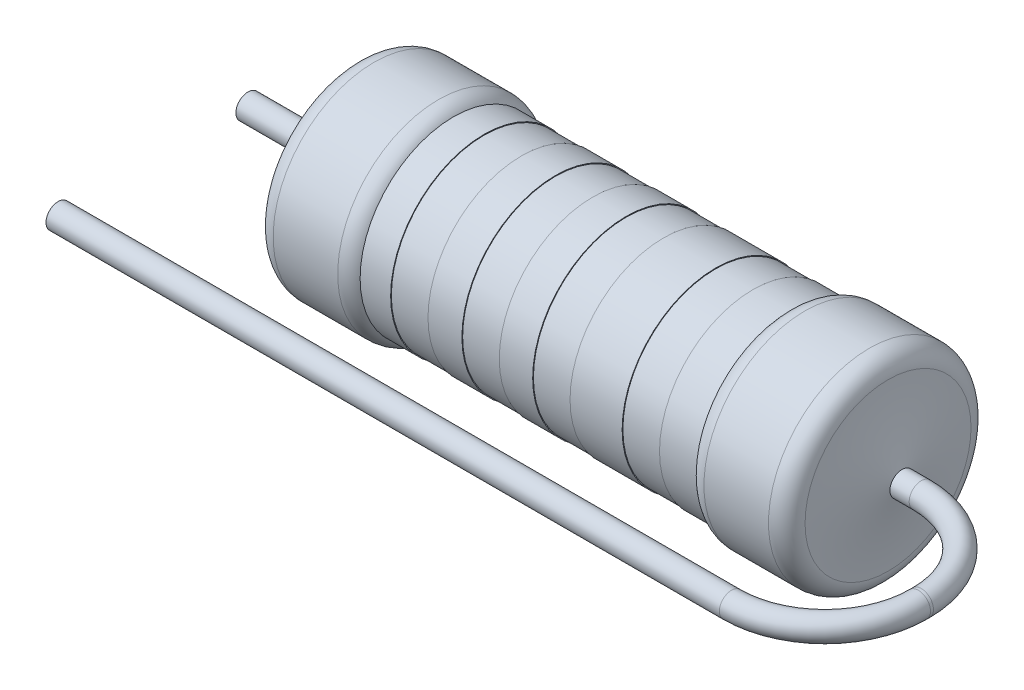
ISO-10303-21;
HEADER;
FILE_DESCRIPTION(('STEP AP214'),'2;1');
FILE_NAME('part.step','',(''),(''),'','','');
FILE_SCHEMA(('AUTOMOTIVE_DESIGN { 1 0 10303 214 1 1 1 1 }'));
ENDSEC;
DATA;
#1=APPLICATION_CONTEXT('core data for automotive mechanical design processes');
#2=APPLICATION_PROTOCOL_DEFINITION('international standard','automotive_design',2000,#1);
#3=PRODUCT_CONTEXT('',#1,'mechanical');
#4=PRODUCT('Part','Part','',(#3));
#5=PRODUCT_RELATED_PRODUCT_CATEGORY('part','',(#4));
#6=PRODUCT_DEFINITION_FORMATION('','',#4);
#7=PRODUCT_DEFINITION_CONTEXT('part definition',#1,'design');
#8=PRODUCT_DEFINITION('design','',#6,#7);
#9=PRODUCT_DEFINITION_SHAPE('','',#8);
#10=(LENGTH_UNIT() NAMED_UNIT(*) SI_UNIT(.MILLI.,.METRE.));
#11=(NAMED_UNIT(*) PLANE_ANGLE_UNIT() SI_UNIT($,.RADIAN.));
#12=(NAMED_UNIT(*) SI_UNIT($,.STERADIAN.) SOLID_ANGLE_UNIT());
#13=UNCERTAINTY_MEASURE_WITH_UNIT(LENGTH_MEASURE(1.E-05),#10,'distance_accuracy_value','');
#14=(GEOMETRIC_REPRESENTATION_CONTEXT(3) GLOBAL_UNCERTAINTY_ASSIGNED_CONTEXT((#13)) GLOBAL_UNIT_ASSIGNED_CONTEXT((#10,
#11,#12)) REPRESENTATION_CONTEXT('',''));
#15=CARTESIAN_POINT('',(0.,0.,0.));
#16=DIRECTION('',(0.,0.,1.));
#17=DIRECTION('',(1.,0.,0.));
#18=AXIS2_PLACEMENT_3D('',#15,#16,#17);
#19=CARTESIAN_POINT('',(7.5,0.,0.));
#20=DIRECTION('',(1.,0.,0.));
#21=DIRECTION('',(0.,0.,-1.));
#22=AXIS2_PLACEMENT_3D('',#19,#20,#21);
#23=PLANE('',#22);
#24=CARTESIAN_POINT('',(7.5,0.,0.));
#25=DIRECTION('',(1.,0.,0.));
#26=DIRECTION('',(0.,0.,-1.));
#27=AXIS2_PLACEMENT_3D('',#24,#25,#26);
#28=CIRCLE('',#27,0.325);
#29=CARTESIAN_POINT('',(7.5,0.,-0.325));
#30=VERTEX_POINT('',#29);
#31=EDGE_CURVE('E57',#30,#30,#28,.T.);
#32=ORIENTED_EDGE('',*,*,#31,.F.);
#33=EDGE_LOOP('',(#32));
#34=FACE_BOUND('',#33,.T.);
#35=ADVANCED_FACE('F45',(#34),#23,.F.);
#36=CARTESIAN_POINT('',(-10.,0.,5.08));
#37=DIRECTION('',(-1.,0.,0.));
#38=DIRECTION('',(0.,0.,1.));
#39=AXIS2_PLACEMENT_3D('',#36,#37,#38);
#40=PLANE('',#39);
#41=CARTESIAN_POINT('',(-10.,0.,5.08));
#42=DIRECTION('',(-1.,0.,0.));
#43=DIRECTION('',(0.,0.,1.));
#44=AXIS2_PLACEMENT_3D('',#41,#42,#43);
#45=CIRCLE('',#44,0.325);
#46=CARTESIAN_POINT('',(-10.,0.,5.405));
#47=VERTEX_POINT('',#46);
#48=EDGE_CURVE('E12',#47,#47,#45,.T.);
#49=ORIENTED_EDGE('',*,*,#48,.T.);
#50=EDGE_LOOP('',(#49));
#51=FACE_BOUND('',#50,.T.);
#52=ADVANCED_FACE('F60',(#51),#40,.T.);
#53=CARTESIAN_POINT('',(7.5,0.,0.));
#54=DIRECTION('',(1.,0.,0.));
#55=DIRECTION('',(0.,0.,-1.));
#56=AXIS2_PLACEMENT_3D('',#53,#54,#55);
#57=CYLINDRICAL_SURFACE('',#56,0.325);
#58=CARTESIAN_POINT('',(8.01672707535682,0.,0.));
#59=DIRECTION('',(1.,0.,0.));
#60=DIRECTION('',(0.,0.,-1.));
#61=AXIS2_PLACEMENT_3D('',#58,#59,#60);
#62=CIRCLE('',#61,0.325);
#63=CARTESIAN_POINT('',(8.01672707535682,0.,-0.324999999999948));
#64=VERTEX_POINT('',#63);
#65=EDGE_CURVE('E77',#64,#64,#62,.T.);
#66=ORIENTED_EDGE('',*,*,#65,.F.);
#67=EDGE_LOOP('',(#66));
#68=FACE_BOUND('',#67,.T.);
#69=ORIENTED_EDGE('',*,*,#31,.T.);
#70=EDGE_LOOP('',(#69));
#71=FACE_BOUND('',#70,.T.);
#72=ADVANCED_FACE('F81',(#68,#71),#57,.T.);
#73=CARTESIAN_POINT('',(8.01672707535683,0.,2.5));
#74=DIRECTION('',(0.,-1.,0.));
#75=DIRECTION('',(0.,0.,-1.));
#76=AXIS2_PLACEMENT_3D('',#73,#74,#75);
#77=TOROIDAL_SURFACE('',#76,2.49999999999995,0.325);
#78=CARTESIAN_POINT('',(10.5167270753568,0.,2.50000000000002));
#79=DIRECTION('',(0.,0.,1.));
#80=DIRECTION('',(1.,0.,0.));
#81=AXIS2_PLACEMENT_3D('',#78,#79,#80);
#82=CIRCLE('',#81,0.325);
#83=CARTESIAN_POINT('',(10.8417270753568,0.,2.50000000000002));
#84=VERTEX_POINT('',#83);
#85=EDGE_CURVE('E72',#84,#84,#82,.T.);
#86=CARTESIAN_POINT('',(8.01672707535683,0.,2.5));
#87=DIRECTION('',(0.,-1.,0.));
#88=DIRECTION('',(0.,0.,-1.));
#89=AXIS2_PLACEMENT_3D('',#86,#87,#88);
#90=CIRCLE('',#89,2.82499999999995);
#91=EDGE_CURVE('',#64,#84,#90,.T.);
#92=ORIENTED_EDGE('',*,*,#65,.T.);
#93=ORIENTED_EDGE('',*,*,#85,.F.);
#94=ORIENTED_EDGE('',*,*,#91,.T.);
#95=ORIENTED_EDGE('',*,*,#91,.F.);
#96=EDGE_LOOP('',(#92,#94,#93,#95));
#97=FACE_BOUND('',#96,.T.);
#98=ADVANCED_FACE('F83',(#97),#77,.T.);
#99=CARTESIAN_POINT('',(10.5167270753568,0.,2.50000000000002));
#100=DIRECTION('',(0.,0.,1.));
#101=DIRECTION('',(1.,0.,0.));
#102=AXIS2_PLACEMENT_3D('',#99,#100,#101);
#103=CYLINDRICAL_SURFACE('',#102,0.325);
#104=CARTESIAN_POINT('',(10.5167270753568,0.,2.57999999999998));
#105=DIRECTION('',(0.,0.,1.));
#106=DIRECTION('',(1.,0.,0.));
#107=AXIS2_PLACEMENT_3D('',#104,#105,#106);
#108=CIRCLE('',#107,0.325);
#109=CARTESIAN_POINT('',(10.8417270753568,0.,2.57999999999998));
#110=VERTEX_POINT('',#109);
#111=EDGE_CURVE('E70',#110,#110,#108,.T.);
#112=ORIENTED_EDGE('',*,*,#111,.F.);
#113=EDGE_LOOP('',(#112));
#114=FACE_BOUND('',#113,.T.);
#115=ORIENTED_EDGE('',*,*,#85,.T.);
#116=EDGE_LOOP('',(#115));
#117=FACE_BOUND('',#116,.T.);
#118=ADVANCED_FACE('F90',(#114,#117),#103,.T.);
#119=CARTESIAN_POINT('',(8.01672707535683,0.,2.58));
#120=DIRECTION('',(0.,-1.,0.));
#121=DIRECTION('',(0.,0.,-1.));
#122=AXIS2_PLACEMENT_3D('',#119,#120,#121);
#123=TOROIDAL_SURFACE('',#122,2.5,0.325);
#124=CARTESIAN_POINT('',(8.01672707535683,0.,5.08));
#125=DIRECTION('',(-1.,0.,0.));
#126=DIRECTION('',(0.,0.,1.));
#127=AXIS2_PLACEMENT_3D('',#124,#125,#126);
#128=CIRCLE('',#127,0.325);
#129=CARTESIAN_POINT('',(8.01672707535683,0.,5.405));
#130=VERTEX_POINT('',#129);
#131=EDGE_CURVE('E52',#130,#130,#128,.T.);
#132=CARTESIAN_POINT('',(8.01672707535683,0.,2.58));
#133=DIRECTION('',(0.,-1.,0.));
#134=DIRECTION('',(0.,0.,-1.));
#135=AXIS2_PLACEMENT_3D('',#132,#133,#134);
#136=CIRCLE('',#135,2.825);
#137=EDGE_CURVE('',#110,#130,#136,.T.);
#138=ORIENTED_EDGE('',*,*,#111,.T.);
#139=ORIENTED_EDGE('',*,*,#131,.F.);
#140=ORIENTED_EDGE('',*,*,#137,.T.);
#141=ORIENTED_EDGE('',*,*,#137,.F.);
#142=EDGE_LOOP('',(#138,#140,#139,#141));
#143=FACE_BOUND('',#142,.T.);
#144=ADVANCED_FACE('F65',(#143),#123,.T.);
#145=CARTESIAN_POINT('',(8.01672707535682,0.,5.08));
#146=DIRECTION('',(-1.,0.,0.));
#147=DIRECTION('',(0.,0.,1.));
#148=AXIS2_PLACEMENT_3D('',#145,#146,#147);
#149=CYLINDRICAL_SURFACE('',#148,0.325);
#150=ORIENTED_EDGE('',*,*,#48,.F.);
#151=EDGE_LOOP('',(#150));
#152=FACE_BOUND('',#151,.T.);
#153=ORIENTED_EDGE('',*,*,#131,.T.);
#154=EDGE_LOOP('',(#153));
#155=FACE_BOUND('',#154,.T.);
#156=ADVANCED_FACE('F62',(#152,#155),#149,.T.);
#157=CLOSED_SHELL('',(#35,#52,#72,#98,#118,#144,#156));
#158=MANIFOLD_SOLID_BREP('B2',#157);
#159=CARTESIAN_POINT('',(-7.11921192761387,2.7,0.));
#160=CARTESIAN_POINT('',(-7.10286794382865,1.32517606269351,0.));
#161=CARTESIAN_POINT('',(-7.5,0.,0.));
#162=B_SPLINE_CURVE_WITH_KNOTS('',2,(#159,#160,#161),.UNSPECIFIED.,.F.,.F.,(3,3),(0.,1.),.UNSPECIFIED.);
#163=CARTESIAN_POINT('',(-9.02816259471025,0.,0.));
#164=DIRECTION('',(-1.,0.,0.));
#165=AXIS1_PLACEMENT('',#163,#164);
#166=SURFACE_OF_REVOLUTION('',#162,#165);
#167=CARTESIAN_POINT('',(-7.40901491383469,0.,0.));
#168=DIRECTION('',(-1.,0.,0.));
#169=DIRECTION('',(0.,-1.,0.));
#170=AXIS2_PLACEMENT_3D('',#167,#168,#169);
#171=CIRCLE('',#170,0.325000000000001);
#172=CARTESIAN_POINT('',(-7.40901491383469,-0.325000000000004,0.));
#173=VERTEX_POINT('',#172);
#174=EDGE_CURVE('E152',#173,#173,#171,.F.);
#175=ORIENTED_EDGE('',*,*,#174,.T.);
#176=EDGE_LOOP('',(#175));
#177=FACE_BOUND('',#176,.T.);
#178=CARTESIAN_POINT('',(-7.12614834481941,0.,0.));
#179=DIRECTION('',(-1.,0.,0.));
#180=DIRECTION('',(0.,-1.,0.));
#181=AXIS2_PLACEMENT_3D('',#178,#179,#180);
#182=CIRCLE('',#181,2.22047582108405);
#183=CARTESIAN_POINT('',(-7.12614834481941,-2.22047582108406,0.));
#184=VERTEX_POINT('',#183);
#185=EDGE_CURVE('E248',#184,#184,#182,.T.);
#186=ORIENTED_EDGE('',*,*,#185,.T.);
#187=EDGE_LOOP('',(#186));
#188=FACE_BOUND('',#187,.T.);
#189=ADVANCED_FACE('F148',(#177,#188),#166,.T.);
#190=CARTESIAN_POINT('',(7.5,0.,0.));
#191=CARTESIAN_POINT('',(7.10286794382865,1.32517606269351,0.));
#192=CARTESIAN_POINT('',(7.11921192761387,2.7,0.));
#193=B_SPLINE_CURVE_WITH_KNOTS('',2,(#190,#191,#192),.UNSPECIFIED.,.F.,.F.,(3,3),(0.,1.),.UNSPECIFIED.);
#194=CARTESIAN_POINT('',(-9.02816259471025,0.,0.));
#195=DIRECTION('',(-1.,0.,0.));
#196=AXIS1_PLACEMENT('',#194,#195);
#197=SURFACE_OF_REVOLUTION('',#193,#196);
#198=CARTESIAN_POINT('',(7.12614834481941,0.,0.));
#199=DIRECTION('',(-1.,0.,0.));
#200=DIRECTION('',(0.,-1.,0.));
#201=AXIS2_PLACEMENT_3D('',#198,#199,#200);
#202=CIRCLE('',#201,2.22047582108398);
#203=CARTESIAN_POINT('',(7.12614834481941,-2.22047582108398,0.));
#204=VERTEX_POINT('',#203);
#205=EDGE_CURVE('E246',#204,#204,#202,.F.);
#206=ORIENTED_EDGE('',*,*,#205,.T.);
#207=EDGE_LOOP('',(#206));
#208=FACE_BOUND('',#207,.T.);
#209=CARTESIAN_POINT('',(7.5,0.,0.));
#210=VERTEX_POINT('',#209);
#211=VERTEX_LOOP('',#210);
#212=FACE_BOUND('',#211,.T.);
#213=ADVANCED_FACE('F159',(#208,#212),#197,.T.);
#214=CARTESIAN_POINT('',(-9.02816259471025,0.,0.));
#215=DIRECTION('',(-1.,0.,0.));
#216=DIRECTION('',(0.,-1.,0.));
#217=AXIS2_PLACEMENT_3D('',#214,#215,#216);
#218=CYLINDRICAL_SURFACE('',#217,2.7);
#219=CARTESIAN_POINT('',(4.9,0.,0.));
#220=DIRECTION('',(-1.,0.,0.));
#221=DIRECTION('',(0.,-1.,0.));
#222=AXIS2_PLACEMENT_3D('',#219,#220,#221);
#223=CIRCLE('',#222,2.7);
#224=CARTESIAN_POINT('',(4.9,-2.7,0.));
#225=VERTEX_POINT('',#224);
#226=EDGE_CURVE('E43',#225,#225,#223,.F.);
#227=ORIENTED_EDGE('',*,*,#226,.T.);
#228=EDGE_LOOP('',(#227));
#229=FACE_BOUND('',#228,.T.);
#230=CARTESIAN_POINT('',(6.62656777999434,0.,0.));
#231=DIRECTION('',(1.,0.,0.));
#232=DIRECTION('',(0.,1.,0.));
#233=AXIS2_PLACEMENT_3D('',#230,#231,#232);
#234=CIRCLE('',#233,2.7);
#235=CARTESIAN_POINT('',(6.62656777999434,2.7,0.));
#236=VERTEX_POINT('',#235);
#237=EDGE_CURVE('E243',#236,#236,#234,.F.);
#238=ORIENTED_EDGE('',*,*,#237,.T.);
#239=EDGE_LOOP('',(#238));
#240=FACE_BOUND('',#239,.T.);
#241=ADVANCED_FACE('F161',(#229,#240),#218,.T.);
#242=CARTESIAN_POINT('',(-9.02816259471025,0.,0.));
#243=DIRECTION('',(-1.,0.,0.));
#244=DIRECTION('',(0.,-1.,0.));
#245=AXIS2_PLACEMENT_3D('',#242,#243,#244);
#246=CYLINDRICAL_SURFACE('',#245,2.5);
#247=CARTESIAN_POINT('',(3.51100246528886,0.,0.));
#248=DIRECTION('',(-1.,0.,0.));
#249=DIRECTION('',(0.,-1.,0.));
#250=AXIS2_PLACEMENT_3D('',#247,#248,#249);
#251=CIRCLE('',#250,2.5);
#252=CARTESIAN_POINT('',(3.51100246528886,-2.5,0.));
#253=VERTEX_POINT('',#252);
#254=EDGE_CURVE('E237',#253,#253,#251,.T.);
#255=ORIENTED_EDGE('',*,*,#254,.F.);
#256=EDGE_LOOP('',(#255));
#257=FACE_BOUND('',#256,.T.);
#258=CARTESIAN_POINT('',(4.5,0.,0.));
#259=DIRECTION('',(-1.,0.,0.));
#260=DIRECTION('',(0.,-1.,0.));
#261=AXIS2_PLACEMENT_3D('',#258,#259,#260);
#262=CIRCLE('',#261,2.5);
#263=CARTESIAN_POINT('',(4.5,-2.5,0.));
#264=VERTEX_POINT('',#263);
#265=EDGE_CURVE('E240',#264,#264,#262,.T.);
#266=ORIENTED_EDGE('',*,*,#265,.T.);
#267=EDGE_LOOP('',(#266));
#268=FACE_BOUND('',#267,.T.);
#269=ADVANCED_FACE('F168',(#257,#268),#246,.T.);
#270=CARTESIAN_POINT('',(3.51100246528886,2.5,0.));
#271=DIRECTION('',(1.,0.,0.));
#272=DIRECTION('',(0.,1.,0.));
#273=AXIS2_PLACEMENT_3D('',#270,#271,#272);
#274=PLANE('',#273);
#275=CARTESIAN_POINT('',(3.51100246528886,0.,0.));
#276=DIRECTION('',(-1.,0.,0.));
#277=DIRECTION('',(0.,-1.,0.));
#278=AXIS2_PLACEMENT_3D('',#275,#276,#277);
#279=CIRCLE('',#278,2.48);
#280=CARTESIAN_POINT('',(3.51100246528886,-2.48,0.));
#281=VERTEX_POINT('',#280);
#282=EDGE_CURVE('E234',#281,#281,#279,.T.);
#283=ORIENTED_EDGE('',*,*,#282,.F.);
#284=EDGE_LOOP('',(#283));
#285=FACE_BOUND('',#284,.T.);
#286=ORIENTED_EDGE('',*,*,#254,.T.);
#287=EDGE_LOOP('',(#286));
#288=FACE_BOUND('',#287,.T.);
#289=ADVANCED_FACE('F347',(#285,#288),#274,.F.);
#290=CARTESIAN_POINT('',(-9.02816259471025,0.,0.));
#291=DIRECTION('',(-1.,0.,0.));
#292=DIRECTION('',(0.,-1.,0.));
#293=AXIS2_PLACEMENT_3D('',#290,#291,#292);
#294=CYLINDRICAL_SURFACE('',#293,2.48);
#295=CARTESIAN_POINT('',(2.51100246528886,0.,0.));
#296=DIRECTION('',(-1.,0.,0.));
#297=DIRECTION('',(0.,-1.,0.));
#298=AXIS2_PLACEMENT_3D('',#295,#296,#297);
#299=CIRCLE('',#298,2.48);
#300=CARTESIAN_POINT('',(2.51100246528886,-2.48,0.));
#301=VERTEX_POINT('',#300);
#302=EDGE_CURVE('E231',#301,#301,#299,.T.);
#303=ORIENTED_EDGE('',*,*,#302,.F.);
#304=EDGE_LOOP('',(#303));
#305=FACE_BOUND('',#304,.T.);
#306=ORIENTED_EDGE('',*,*,#282,.T.);
#307=EDGE_LOOP('',(#306));
#308=FACE_BOUND('',#307,.T.);
#309=ADVANCED_FACE('F343',(#305,#308),#294,.T.);
#310=CARTESIAN_POINT('',(2.51100246528886,2.5,0.));
#311=DIRECTION('',(-1.,0.,0.));
#312=DIRECTION('',(0.,-1.,0.));
#313=AXIS2_PLACEMENT_3D('',#310,#311,#312);
#314=PLANE('',#313);
#315=CARTESIAN_POINT('',(2.51100246528886,0.,0.));
#316=DIRECTION('',(-1.,0.,0.));
#317=DIRECTION('',(0.,-1.,0.));
#318=AXIS2_PLACEMENT_3D('',#315,#316,#317);
#319=CIRCLE('',#318,2.5);
#320=CARTESIAN_POINT('',(2.51100246528886,-2.5,0.));
#321=VERTEX_POINT('',#320);
#322=EDGE_CURVE('E228',#321,#321,#319,.T.);
#323=ORIENTED_EDGE('',*,*,#322,.F.);
#324=EDGE_LOOP('',(#323));
#325=FACE_BOUND('',#324,.T.);
#326=ORIENTED_EDGE('',*,*,#302,.T.);
#327=EDGE_LOOP('',(#326));
#328=FACE_BOUND('',#327,.T.);
#329=ADVANCED_FACE('F339',(#325,#328),#314,.F.);
#330=CARTESIAN_POINT('',(-9.02816259471025,0.,0.));
#331=DIRECTION('',(-1.,0.,0.));
#332=DIRECTION('',(0.,-1.,0.));
#333=AXIS2_PLACEMENT_3D('',#330,#331,#332);
#334=CYLINDRICAL_SURFACE('',#333,2.5);
#335=CARTESIAN_POINT('',(1.1168513081302,0.,0.));
#336=DIRECTION('',(-1.,0.,0.));
#337=DIRECTION('',(0.,-1.,0.));
#338=AXIS2_PLACEMENT_3D('',#335,#336,#337);
#339=CIRCLE('',#338,2.5);
#340=CARTESIAN_POINT('',(1.1168513081302,-2.5,0.));
#341=VERTEX_POINT('',#340);
#342=EDGE_CURVE('E225',#341,#341,#339,.T.);
#343=ORIENTED_EDGE('',*,*,#342,.F.);
#344=EDGE_LOOP('',(#343));
#345=FACE_BOUND('',#344,.T.);
#346=ORIENTED_EDGE('',*,*,#322,.T.);
#347=EDGE_LOOP('',(#346));
#348=FACE_BOUND('',#347,.T.);
#349=ADVANCED_FACE('F335',(#345,#348),#334,.T.);
#350=CARTESIAN_POINT('',(1.1168513081302,2.5,0.));
#351=DIRECTION('',(1.,0.,0.));
#352=DIRECTION('',(0.,1.,0.));
#353=AXIS2_PLACEMENT_3D('',#350,#351,#352);
#354=PLANE('',#353);
#355=CARTESIAN_POINT('',(1.1168513081302,0.,0.));
#356=DIRECTION('',(-1.,0.,0.));
#357=DIRECTION('',(0.,-1.,0.));
#358=AXIS2_PLACEMENT_3D('',#355,#356,#357);
#359=CIRCLE('',#358,2.48);
#360=CARTESIAN_POINT('',(1.1168513081302,-2.48,0.));
#361=VERTEX_POINT('',#360);
#362=EDGE_CURVE('E222',#361,#361,#359,.T.);
#363=ORIENTED_EDGE('',*,*,#362,.F.);
#364=EDGE_LOOP('',(#363));
#365=FACE_BOUND('',#364,.T.);
#366=ORIENTED_EDGE('',*,*,#342,.T.);
#367=EDGE_LOOP('',(#366));
#368=FACE_BOUND('',#367,.T.);
#369=ADVANCED_FACE('F331',(#365,#368),#354,.F.);
#370=CARTESIAN_POINT('',(-9.02816259471025,0.,0.));
#371=DIRECTION('',(-1.,0.,0.));
#372=DIRECTION('',(0.,-1.,0.));
#373=AXIS2_PLACEMENT_3D('',#370,#371,#372);
#374=CYLINDRICAL_SURFACE('',#373,2.48);
#375=CARTESIAN_POINT('',(0.116851308130198,0.,0.));
#376=DIRECTION('',(-1.,0.,0.));
#377=DIRECTION('',(0.,-1.,0.));
#378=AXIS2_PLACEMENT_3D('',#375,#376,#377);
#379=CIRCLE('',#378,2.48);
#380=CARTESIAN_POINT('',(0.116851308130198,-2.48,0.));
#381=VERTEX_POINT('',#380);
#382=EDGE_CURVE('E219',#381,#381,#379,.T.);
#383=ORIENTED_EDGE('',*,*,#382,.F.);
#384=EDGE_LOOP('',(#383));
#385=FACE_BOUND('',#384,.T.);
#386=ORIENTED_EDGE('',*,*,#362,.T.);
#387=EDGE_LOOP('',(#386));
#388=FACE_BOUND('',#387,.T.);
#389=ADVANCED_FACE('F327',(#385,#388),#374,.T.);
#390=CARTESIAN_POINT('',(0.116851308130198,2.5,0.));
#391=DIRECTION('',(-1.,0.,0.));
#392=DIRECTION('',(0.,-1.,0.));
#393=AXIS2_PLACEMENT_3D('',#390,#391,#392);
#394=PLANE('',#393);
#395=CARTESIAN_POINT('',(0.116851308130198,0.,0.));
#396=DIRECTION('',(-1.,0.,0.));
#397=DIRECTION('',(0.,-1.,0.));
#398=AXIS2_PLACEMENT_3D('',#395,#396,#397);
#399=CIRCLE('',#398,2.5);
#400=CARTESIAN_POINT('',(0.116851308130198,-2.5,0.));
#401=VERTEX_POINT('',#400);
#402=EDGE_CURVE('E216',#401,#401,#399,.T.);
#403=ORIENTED_EDGE('',*,*,#402,.F.);
#404=EDGE_LOOP('',(#403));
#405=FACE_BOUND('',#404,.T.);
#406=ORIENTED_EDGE('',*,*,#382,.T.);
#407=EDGE_LOOP('',(#406));
#408=FACE_BOUND('',#407,.T.);
#409=ADVANCED_FACE('F323',(#405,#408),#394,.F.);
#410=CARTESIAN_POINT('',(-9.02816259471025,0.,0.));
#411=DIRECTION('',(-1.,0.,0.));
#412=DIRECTION('',(0.,-1.,0.));
#413=AXIS2_PLACEMENT_3D('',#410,#411,#412);
#414=CYLINDRICAL_SURFACE('',#413,2.5);
#415=CARTESIAN_POINT('',(-0.776827573238232,0.,0.));
#416=DIRECTION('',(-1.,0.,0.));
#417=DIRECTION('',(0.,-1.,0.));
#418=AXIS2_PLACEMENT_3D('',#415,#416,#417);
#419=CIRCLE('',#418,2.5);
#420=CARTESIAN_POINT('',(-0.776827573238231,-2.5,0.));
#421=VERTEX_POINT('',#420);
#422=EDGE_CURVE('E213',#421,#421,#419,.T.);
#423=ORIENTED_EDGE('',*,*,#422,.F.);
#424=EDGE_LOOP('',(#423));
#425=FACE_BOUND('',#424,.T.);
#426=ORIENTED_EDGE('',*,*,#402,.T.);
#427=EDGE_LOOP('',(#426));
#428=FACE_BOUND('',#427,.T.);
#429=ADVANCED_FACE('F319',(#425,#428),#414,.T.);
#430=CARTESIAN_POINT('',(-0.776827573238233,2.5,0.));
#431=DIRECTION('',(1.,0.,0.));
#432=DIRECTION('',(0.,1.,0.));
#433=AXIS2_PLACEMENT_3D('',#430,#431,#432);
#434=PLANE('',#433);
#435=CARTESIAN_POINT('',(-0.776827573238232,0.,0.));
#436=DIRECTION('',(-1.,0.,0.));
#437=DIRECTION('',(0.,-1.,0.));
#438=AXIS2_PLACEMENT_3D('',#435,#436,#437);
#439=CIRCLE('',#438,2.48);
#440=CARTESIAN_POINT('',(-0.776827573238231,-2.48,0.));
#441=VERTEX_POINT('',#440);
#442=EDGE_CURVE('E210',#441,#441,#439,.T.);
#443=ORIENTED_EDGE('',*,*,#442,.F.);
#444=EDGE_LOOP('',(#443));
#445=FACE_BOUND('',#444,.T.);
#446=ORIENTED_EDGE('',*,*,#422,.T.);
#447=EDGE_LOOP('',(#446));
#448=FACE_BOUND('',#447,.T.);
#449=ADVANCED_FACE('F315',(#445,#448),#434,.F.);
#450=CARTESIAN_POINT('',(-9.02816259471025,0.,0.));
#451=DIRECTION('',(-1.,0.,0.));
#452=DIRECTION('',(0.,-1.,0.));
#453=AXIS2_PLACEMENT_3D('',#450,#451,#452);
#454=CYLINDRICAL_SURFACE('',#453,2.48);
#455=CARTESIAN_POINT('',(-1.77682757323823,0.,0.));
#456=DIRECTION('',(-1.,0.,0.));
#457=DIRECTION('',(0.,-1.,0.));
#458=AXIS2_PLACEMENT_3D('',#455,#456,#457);
#459=CIRCLE('',#458,2.48);
#460=CARTESIAN_POINT('',(-1.77682757323823,-2.48,0.));
#461=VERTEX_POINT('',#460);
#462=EDGE_CURVE('E207',#461,#461,#459,.T.);
#463=ORIENTED_EDGE('',*,*,#462,.F.);
#464=EDGE_LOOP('',(#463));
#465=FACE_BOUND('',#464,.T.);
#466=ORIENTED_EDGE('',*,*,#442,.T.);
#467=EDGE_LOOP('',(#466));
#468=FACE_BOUND('',#467,.T.);
#469=ADVANCED_FACE('F311',(#465,#468),#454,.T.);
#470=CARTESIAN_POINT('',(-1.77682757323823,2.5,0.));
#471=DIRECTION('',(-1.,0.,0.));
#472=DIRECTION('',(0.,-1.,0.));
#473=AXIS2_PLACEMENT_3D('',#470,#471,#472);
#474=PLANE('',#473);
#475=CARTESIAN_POINT('',(-1.77682757323823,0.,0.));
#476=DIRECTION('',(-1.,0.,0.));
#477=DIRECTION('',(0.,-1.,0.));
#478=AXIS2_PLACEMENT_3D('',#475,#476,#477);
#479=CIRCLE('',#478,2.5);
#480=CARTESIAN_POINT('',(-1.77682757323823,-2.5,0.));
#481=VERTEX_POINT('',#480);
#482=EDGE_CURVE('E204',#481,#481,#479,.T.);
#483=ORIENTED_EDGE('',*,*,#482,.F.);
#484=EDGE_LOOP('',(#483));
#485=FACE_BOUND('',#484,.T.);
#486=ORIENTED_EDGE('',*,*,#462,.T.);
#487=EDGE_LOOP('',(#486));
#488=FACE_BOUND('',#487,.T.);
#489=ADVANCED_FACE('F307',(#485,#488),#474,.F.);
#490=CARTESIAN_POINT('',(-9.02816259471025,0.,0.));
#491=DIRECTION('',(-1.,0.,0.));
#492=DIRECTION('',(0.,-1.,0.));
#493=AXIS2_PLACEMENT_3D('',#490,#491,#492);
#494=CYLINDRICAL_SURFACE('',#493,2.5);
#495=CARTESIAN_POINT('',(-2.68403273233072,0.,0.));
#496=DIRECTION('',(-1.,0.,0.));
#497=DIRECTION('',(0.,-1.,0.));
#498=AXIS2_PLACEMENT_3D('',#495,#496,#497);
#499=CIRCLE('',#498,2.5);
#500=CARTESIAN_POINT('',(-2.68403273233072,-2.5,0.));
#501=VERTEX_POINT('',#500);
#502=EDGE_CURVE('E201',#501,#501,#499,.T.);
#503=ORIENTED_EDGE('',*,*,#502,.F.);
#504=EDGE_LOOP('',(#503));
#505=FACE_BOUND('',#504,.T.);
#506=ORIENTED_EDGE('',*,*,#482,.T.);
#507=EDGE_LOOP('',(#506));
#508=FACE_BOUND('',#507,.T.);
#509=ADVANCED_FACE('F303',(#505,#508),#494,.T.);
#510=CARTESIAN_POINT('',(-2.68403273233072,2.5,0.));
#511=DIRECTION('',(1.,0.,0.));
#512=DIRECTION('',(0.,1.,0.));
#513=AXIS2_PLACEMENT_3D('',#510,#511,#512);
#514=PLANE('',#513);
#515=CARTESIAN_POINT('',(-2.68403273233072,0.,0.));
#516=DIRECTION('',(-1.,0.,0.));
#517=DIRECTION('',(0.,-1.,0.));
#518=AXIS2_PLACEMENT_3D('',#515,#516,#517);
#519=CIRCLE('',#518,2.48);
#520=CARTESIAN_POINT('',(-2.68403273233072,-2.48,0.));
#521=VERTEX_POINT('',#520);
#522=EDGE_CURVE('E198',#521,#521,#519,.T.);
#523=ORIENTED_EDGE('',*,*,#522,.F.);
#524=EDGE_LOOP('',(#523));
#525=FACE_BOUND('',#524,.T.);
#526=ORIENTED_EDGE('',*,*,#502,.T.);
#527=EDGE_LOOP('',(#526));
#528=FACE_BOUND('',#527,.T.);
#529=ADVANCED_FACE('F299',(#525,#528),#514,.F.);
#530=CARTESIAN_POINT('',(-9.02816259471025,0.,0.));
#531=DIRECTION('',(-1.,0.,0.));
#532=DIRECTION('',(0.,-1.,0.));
#533=AXIS2_PLACEMENT_3D('',#530,#531,#532);
#534=CYLINDRICAL_SURFACE('',#533,2.48);
#535=CARTESIAN_POINT('',(-3.68403273233072,0.,0.));
#536=DIRECTION('',(-1.,0.,0.));
#537=DIRECTION('',(0.,-1.,0.));
#538=AXIS2_PLACEMENT_3D('',#535,#536,#537);
#539=CIRCLE('',#538,2.48);
#540=CARTESIAN_POINT('',(-3.68403273233072,-2.48,0.));
#541=VERTEX_POINT('',#540);
#542=EDGE_CURVE('E195',#541,#541,#539,.T.);
#543=ORIENTED_EDGE('',*,*,#542,.F.);
#544=EDGE_LOOP('',(#543));
#545=FACE_BOUND('',#544,.T.);
#546=ORIENTED_EDGE('',*,*,#522,.T.);
#547=EDGE_LOOP('',(#546));
#548=FACE_BOUND('',#547,.T.);
#549=ADVANCED_FACE('F295',(#545,#548),#534,.T.);
#550=CARTESIAN_POINT('',(-3.68403273233072,2.5,0.));
#551=DIRECTION('',(-1.,0.,0.));
#552=DIRECTION('',(0.,-1.,0.));
#553=AXIS2_PLACEMENT_3D('',#550,#551,#552);
#554=PLANE('',#553);
#555=CARTESIAN_POINT('',(-3.68403273233072,0.,0.));
#556=DIRECTION('',(-1.,0.,0.));
#557=DIRECTION('',(0.,-1.,0.));
#558=AXIS2_PLACEMENT_3D('',#555,#556,#557);
#559=CIRCLE('',#558,2.5);
#560=CARTESIAN_POINT('',(-3.68403273233072,-2.5,0.));
#561=VERTEX_POINT('',#560);
#562=EDGE_CURVE('E192',#561,#561,#559,.T.);
#563=ORIENTED_EDGE('',*,*,#562,.F.);
#564=EDGE_LOOP('',(#563));
#565=FACE_BOUND('',#564,.T.);
#566=ORIENTED_EDGE('',*,*,#542,.T.);
#567=EDGE_LOOP('',(#566));
#568=FACE_BOUND('',#567,.T.);
#569=ADVANCED_FACE('F287',(#565,#568),#554,.F.);
#570=CARTESIAN_POINT('',(-9.02816259471025,0.,0.));
#571=DIRECTION('',(-1.,0.,0.));
#572=DIRECTION('',(0.,-1.,0.));
#573=AXIS2_PLACEMENT_3D('',#570,#571,#572);
#574=CYLINDRICAL_SURFACE('',#573,2.5);
#575=CARTESIAN_POINT('',(-4.5,0.,0.));
#576=DIRECTION('',(-1.,0.,0.));
#577=DIRECTION('',(0.,-1.,0.));
#578=AXIS2_PLACEMENT_3D('',#575,#576,#577);
#579=CIRCLE('',#578,2.5);
#580=CARTESIAN_POINT('',(-4.5,-2.5,0.));
#581=VERTEX_POINT('',#580);
#582=EDGE_CURVE('E186',#581,#581,#579,.T.);
#583=ORIENTED_EDGE('',*,*,#582,.F.);
#584=EDGE_LOOP('',(#583));
#585=FACE_BOUND('',#584,.T.);
#586=ORIENTED_EDGE('',*,*,#562,.T.);
#587=EDGE_LOOP('',(#586));
#588=FACE_BOUND('',#587,.T.);
#589=ADVANCED_FACE('F278',(#585,#588),#574,.T.);
#590=CARTESIAN_POINT('',(-9.02816259471025,0.,0.));
#591=DIRECTION('',(-1.,0.,0.));
#592=DIRECTION('',(0.,-1.,0.));
#593=AXIS2_PLACEMENT_3D('',#590,#591,#592);
#594=CYLINDRICAL_SURFACE('',#593,2.7);
#595=CARTESIAN_POINT('',(-4.9,0.,0.));
#596=DIRECTION('',(1.,0.,0.));
#597=DIRECTION('',(0.,1.,0.));
#598=AXIS2_PLACEMENT_3D('',#595,#596,#597);
#599=CIRCLE('',#598,2.7);
#600=CARTESIAN_POINT('',(-4.9,2.7,0.));
#601=VERTEX_POINT('',#600);
#602=EDGE_CURVE('E156',#601,#601,#599,.F.);
#603=ORIENTED_EDGE('',*,*,#602,.T.);
#604=EDGE_LOOP('',(#603));
#605=FACE_BOUND('',#604,.T.);
#606=CARTESIAN_POINT('',(-6.62656777999434,0.,0.));
#607=DIRECTION('',(1.,0.,0.));
#608=DIRECTION('',(0.,1.,0.));
#609=AXIS2_PLACEMENT_3D('',#606,#607,#608);
#610=CIRCLE('',#609,2.7);
#611=CARTESIAN_POINT('',(-6.62656777999434,2.7,0.));
#612=VERTEX_POINT('',#611);
#613=EDGE_CURVE('E251',#612,#612,#610,.T.);
#614=ORIENTED_EDGE('',*,*,#613,.T.);
#615=EDGE_LOOP('',(#614));
#616=FACE_BOUND('',#615,.T.);
#617=ADVANCED_FACE('F257',(#605,#616),#594,.T.);
#618=CARTESIAN_POINT('',(6.62656777999434,0.,0.));
#619=DIRECTION('',(1.,0.,0.));
#620=DIRECTION('',(0.,1.,0.));
#621=AXIS2_PLACEMENT_3D('',#618,#619,#620);
#622=TOROIDAL_SURFACE('',#621,2.2,0.5);
#623=ORIENTED_EDGE('',*,*,#205,.F.);
#624=EDGE_LOOP('',(#623));
#625=FACE_BOUND('',#624,.T.);
#626=ORIENTED_EDGE('',*,*,#237,.F.);
#627=EDGE_LOOP('',(#626));
#628=FACE_BOUND('',#627,.T.);
#629=ADVANCED_FACE('F270',(#625,#628),#622,.T.);
#630=CARTESIAN_POINT('',(-6.62656777999434,0.,0.));
#631=DIRECTION('',(1.,0.,0.));
#632=DIRECTION('',(0.,1.,0.));
#633=AXIS2_PLACEMENT_3D('',#630,#631,#632);
#634=TOROIDAL_SURFACE('',#633,2.2,0.5);
#635=ORIENTED_EDGE('',*,*,#613,.F.);
#636=EDGE_LOOP('',(#635));
#637=FACE_BOUND('',#636,.T.);
#638=ORIENTED_EDGE('',*,*,#185,.F.);
#639=EDGE_LOOP('',(#638));
#640=FACE_BOUND('',#639,.T.);
#641=ADVANCED_FACE('F262',(#637,#640),#634,.T.);
#642=CARTESIAN_POINT('',(-4.9,0.,0.));
#643=DIRECTION('',(1.,0.,0.));
#644=DIRECTION('',(0.,1.,0.));
#645=AXIS2_PLACEMENT_3D('',#642,#643,#644);
#646=TOROIDAL_SURFACE('',#645,2.2,0.5);
#647=ORIENTED_EDGE('',*,*,#582,.T.);
#648=EDGE_LOOP('',(#647));
#649=FACE_BOUND('',#648,.T.);
#650=ORIENTED_EDGE('',*,*,#602,.F.);
#651=EDGE_LOOP('',(#650));
#652=FACE_BOUND('',#651,.T.);
#653=ADVANCED_FACE('F260',(#649,#652),#646,.T.);
#654=CARTESIAN_POINT('',(4.9,0.,0.));
#655=DIRECTION('',(-1.,0.,0.));
#656=DIRECTION('',(0.,-1.,0.));
#657=AXIS2_PLACEMENT_3D('',#654,#655,#656);
#658=TOROIDAL_SURFACE('',#657,2.2,0.5);
#659=ORIENTED_EDGE('',*,*,#226,.F.);
#660=EDGE_LOOP('',(#659));
#661=FACE_BOUND('',#660,.T.);
#662=ORIENTED_EDGE('',*,*,#265,.F.);
#663=EDGE_LOOP('',(#662));
#664=FACE_BOUND('',#663,.T.);
#665=ADVANCED_FACE('F150',(#661,#664),#658,.T.);
#666=CARTESIAN_POINT('',(-10.,0.,0.));
#667=DIRECTION('',(1.,0.,0.));
#668=DIRECTION('',(0.,0.,-1.));
#669=AXIS2_PLACEMENT_3D('',#666,#667,#668);
#670=CYLINDRICAL_SURFACE('',#669,0.325);
#671=CARTESIAN_POINT('',(-10.,0.,0.));
#672=DIRECTION('',(1.,0.,0.));
#673=DIRECTION('',(0.,0.,-1.));
#674=AXIS2_PLACEMENT_3D('',#671,#672,#673);
#675=CIRCLE('',#674,0.325);
#676=CARTESIAN_POINT('',(-10.,0.,-0.325));
#677=VERTEX_POINT('',#676);
#678=EDGE_CURVE('E487',#677,#677,#675,.T.);
#679=ORIENTED_EDGE('',*,*,#678,.T.);
#680=EDGE_LOOP('',(#679));
#681=FACE_BOUND('',#680,.T.);
#682=ORIENTED_EDGE('',*,*,#174,.F.);
#683=EDGE_LOOP('',(#682));
#684=FACE_BOUND('',#683,.T.);
#685=ADVANCED_FACE('F268',(#681,#684),#670,.T.);
#686=CARTESIAN_POINT('',(-10.,0.,0.));
#687=DIRECTION('',(1.,0.,0.));
#688=DIRECTION('',(0.,0.,-1.));
#689=AXIS2_PLACEMENT_3D('',#686,#687,#688);
#690=PLANE('',#689);
#691=ORIENTED_EDGE('',*,*,#678,.F.);
#692=EDGE_LOOP('',(#691));
#693=FACE_BOUND('',#692,.T.);
#694=ADVANCED_FACE('F473',(#693),#690,.F.);
#695=CLOSED_SHELL('',(#189,#213,#241,#269,#289,#309,#329,#349,#369,#389,#409,#429,#449,#469,
#489,#509,#529,#549,#569,#589,#617,#629,#641,#653,#665,#685,#694));
#696=MANIFOLD_SOLID_BREP('B6',#695);
#697=ADVANCED_BREP_SHAPE_REPRESENTATION('',(#18,#158,#696),#14);
#698=SHAPE_DEFINITION_REPRESENTATION(#9,#697);
ENDSEC;
END-ISO-10303-21;
